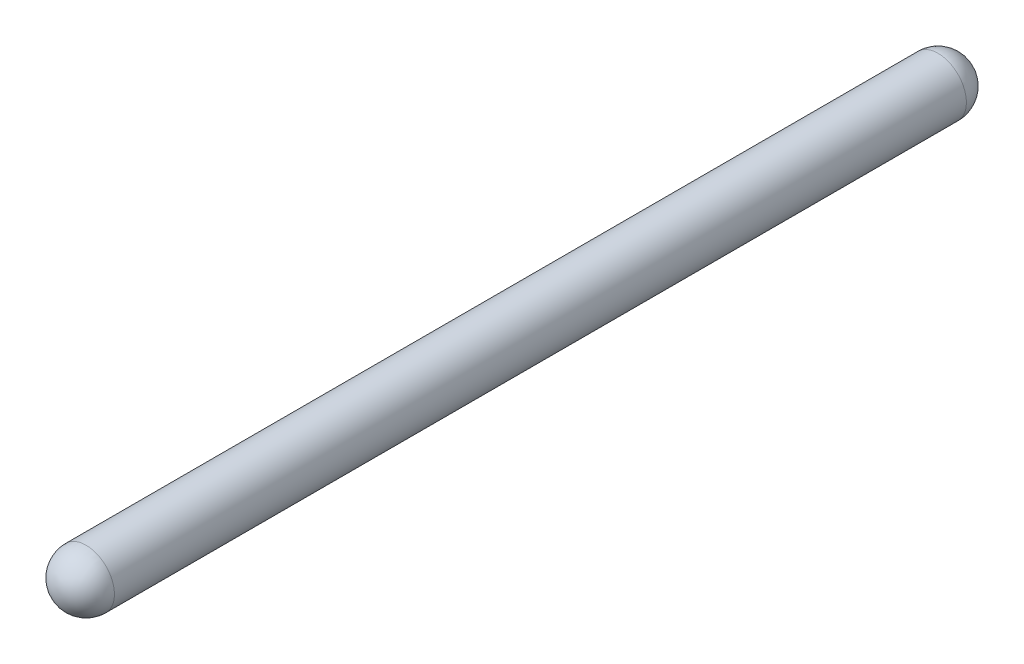
ISO-10303-21;
HEADER;
FILE_DESCRIPTION(('STEP AP214'),'2;1');
FILE_NAME('part.step','',(''),(''),'','','');
FILE_SCHEMA(('AUTOMOTIVE_DESIGN { 1 0 10303 214 1 1 1 1 }'));
ENDSEC;
DATA;
#1=APPLICATION_CONTEXT('core data for automotive mechanical design processes');
#2=APPLICATION_PROTOCOL_DEFINITION('international standard','automotive_design',2000,#1);
#3=PRODUCT_CONTEXT('',#1,'mechanical');
#4=PRODUCT('Part','Part','',(#3));
#5=PRODUCT_RELATED_PRODUCT_CATEGORY('part','',(#4));
#6=PRODUCT_DEFINITION_FORMATION('','',#4);
#7=PRODUCT_DEFINITION_CONTEXT('part definition',#1,'design');
#8=PRODUCT_DEFINITION('design','',#6,#7);
#9=PRODUCT_DEFINITION_SHAPE('','',#8);
#10=(LENGTH_UNIT() NAMED_UNIT(*) SI_UNIT(.MILLI.,.METRE.));
#11=(NAMED_UNIT(*) PLANE_ANGLE_UNIT() SI_UNIT($,.RADIAN.));
#12=(NAMED_UNIT(*) SI_UNIT($,.STERADIAN.) SOLID_ANGLE_UNIT());
#13=UNCERTAINTY_MEASURE_WITH_UNIT(LENGTH_MEASURE(1.E-05),#10,'distance_accuracy_value','');
#14=(GEOMETRIC_REPRESENTATION_CONTEXT(3) GLOBAL_UNCERTAINTY_ASSIGNED_CONTEXT((#13)) GLOBAL_UNIT_ASSIGNED_CONTEXT((#10,
#11,#12)) REPRESENTATION_CONTEXT('',''));
#15=CARTESIAN_POINT('',(0.,0.,0.));
#16=DIRECTION('',(0.,0.,1.));
#17=DIRECTION('',(1.,0.,0.));
#18=AXIS2_PLACEMENT_3D('',#15,#16,#17);
#19=CARTESIAN_POINT('',(0.,0.,-3.));
#20=DIRECTION('',(1.,0.,0.));
#21=DIRECTION('',(0.,-1.,0.));
#22=AXIS2_PLACEMENT_3D('',#19,#20,#21);
#23=SPHERICAL_SURFACE('',#22,0.5);
#24=CARTESIAN_POINT('',(0.,0.,-3.));
#25=DIRECTION('',(0.,0.,1.));
#26=DIRECTION('',(1.,0.,0.));
#27=AXIS2_PLACEMENT_3D('',#24,#25,#26);
#28=CIRCLE('',#27,0.5);
#29=CARTESIAN_POINT('',(0.5,0.,-3.));
#30=VERTEX_POINT('',#29);
#31=CARTESIAN_POINT('',(-0.5,0.,-3.));
#32=VERTEX_POINT('',#31);
#33=EDGE_CURVE('E42',#30,#32,#28,.T.);
#34=ORIENTED_EDGE('',*,*,#33,.F.);
#35=CARTESIAN_POINT('',(0.,0.,-3.));
#36=DIRECTION('',(0.,0.,1.));
#37=DIRECTION('',(1.,0.,0.));
#38=AXIS2_PLACEMENT_3D('',#35,#36,#37);
#39=CIRCLE('',#38,0.5);
#40=EDGE_CURVE('E26',#32,#30,#39,.T.);
#41=ORIENTED_EDGE('',*,*,#40,.F.);
#42=EDGE_LOOP('',(#34,#41));
#43=FACE_BOUND('',#42,.T.);
#44=ADVANCED_FACE('F17',(#43),#23,.T.);
#45=CARTESIAN_POINT('',(0.,0.,12.));
#46=DIRECTION('',(1.,0.,0.));
#47=DIRECTION('',(0.,1.,0.));
#48=AXIS2_PLACEMENT_3D('',#45,#46,#47);
#49=SPHERICAL_SURFACE('',#48,0.5);
#50=CARTESIAN_POINT('',(0.,0.,12.));
#51=DIRECTION('',(0.,0.,1.));
#52=DIRECTION('',(1.,0.,0.));
#53=AXIS2_PLACEMENT_3D('',#50,#51,#52);
#54=CIRCLE('',#53,0.5);
#55=CARTESIAN_POINT('',(0.5,0.,12.));
#56=VERTEX_POINT('',#55);
#57=CARTESIAN_POINT('',(-0.5,0.,12.));
#58=VERTEX_POINT('',#57);
#59=EDGE_CURVE('E11',#56,#58,#54,.F.);
#60=ORIENTED_EDGE('',*,*,#59,.F.);
#61=CARTESIAN_POINT('',(0.,0.,12.));
#62=DIRECTION('',(0.,0.,1.));
#63=DIRECTION('',(1.,0.,0.));
#64=AXIS2_PLACEMENT_3D('',#61,#62,#63);
#65=CIRCLE('',#64,0.5);
#66=EDGE_CURVE('E34',#58,#56,#65,.F.);
#67=ORIENTED_EDGE('',*,*,#66,.F.);
#68=EDGE_LOOP('',(#60,#67));
#69=FACE_BOUND('',#68,.T.);
#70=ADVANCED_FACE('F49',(#69),#49,.T.);
#71=CARTESIAN_POINT('',(0.,0.,-3.));
#72=DIRECTION('',(0.,0.,1.));
#73=DIRECTION('',(1.,0.,0.));
#74=AXIS2_PLACEMENT_3D('',#71,#72,#73);
#75=CYLINDRICAL_SURFACE('',#74,0.5);
#76=ORIENTED_EDGE('',*,*,#66,.T.);
#77=ORIENTED_EDGE('',*,*,#59,.T.);
#78=EDGE_LOOP('',(#76,#77));
#79=FACE_BOUND('',#78,.T.);
#80=ORIENTED_EDGE('',*,*,#40,.T.);
#81=ORIENTED_EDGE('',*,*,#33,.T.);
#82=EDGE_LOOP('',(#80,#81));
#83=FACE_BOUND('',#82,.T.);
#84=ADVANCED_FACE('F45',(#79,#83),#75,.T.);
#85=CLOSED_SHELL('',(#44,#70,#84));
#86=MANIFOLD_SOLID_BREP('B1',#85);
#87=ADVANCED_BREP_SHAPE_REPRESENTATION('',(#18,#86),#14);
#88=SHAPE_DEFINITION_REPRESENTATION(#9,#87);
ENDSEC;
END-ISO-10303-21;
